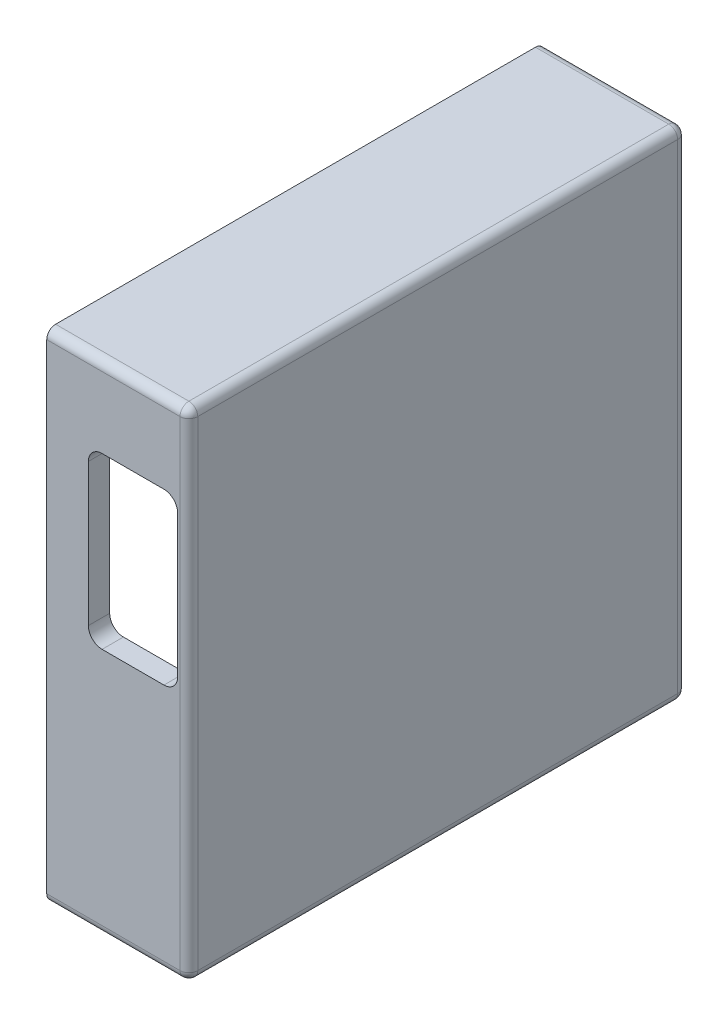
ISO-10303-21;
HEADER;
FILE_DESCRIPTION(('STEP AP214'),'2;1');
FILE_NAME('part.step','',(''),(''),'','','');
FILE_SCHEMA(('AUTOMOTIVE_DESIGN { 1 0 10303 214 1 1 1 1 }'));
ENDSEC;
DATA;
#1=APPLICATION_CONTEXT('core data for automotive mechanical design processes');
#2=APPLICATION_PROTOCOL_DEFINITION('international standard','automotive_design',2000,#1);
#3=PRODUCT_CONTEXT('',#1,'mechanical');
#4=PRODUCT('Part','Part','',(#3));
#5=PRODUCT_RELATED_PRODUCT_CATEGORY('part','',(#4));
#6=PRODUCT_DEFINITION_FORMATION('','',#4);
#7=PRODUCT_DEFINITION_CONTEXT('part definition',#1,'design');
#8=PRODUCT_DEFINITION('design','',#6,#7);
#9=PRODUCT_DEFINITION_SHAPE('','',#8);
#10=(LENGTH_UNIT() NAMED_UNIT(*) SI_UNIT(.MILLI.,.METRE.));
#11=(NAMED_UNIT(*) PLANE_ANGLE_UNIT() SI_UNIT($,.RADIAN.));
#12=(NAMED_UNIT(*) SI_UNIT($,.STERADIAN.) SOLID_ANGLE_UNIT());
#13=UNCERTAINTY_MEASURE_WITH_UNIT(LENGTH_MEASURE(1.E-05),#10,'distance_accuracy_value','');
#14=(GEOMETRIC_REPRESENTATION_CONTEXT(3) GLOBAL_UNCERTAINTY_ASSIGNED_CONTEXT((#13)) GLOBAL_UNIT_ASSIGNED_CONTEXT((#10,
#11,#12)) REPRESENTATION_CONTEXT('',''));
#15=CARTESIAN_POINT('',(0.,0.,0.));
#16=DIRECTION('',(0.,0.,1.));
#17=DIRECTION('',(1.,0.,0.));
#18=AXIS2_PLACEMENT_3D('',#15,#16,#17);
#19=CARTESIAN_POINT('',(25.4,0.,0.));
#20=DIRECTION('',(1.,0.,0.));
#21=DIRECTION('',(0.,0.,-1.));
#22=AXIS2_PLACEMENT_3D('',#19,#20,#21);
#23=PLANE('',#22);
#24=CARTESIAN_POINT('',(25.4,-85.725,85.725));
#25=DIRECTION('',(1.,0.,0.));
#26=DIRECTION('',(0.,0.,-1.));
#27=AXIS2_PLACEMENT_3D('',#24,#25,#26);
#28=CIRCLE('',#27,3.175);
#29=CARTESIAN_POINT('',(25.4,-88.9,85.725));
#30=VERTEX_POINT('',#29);
#31=CARTESIAN_POINT('',(25.4,-85.725,88.9));
#32=VERTEX_POINT('',#31);
#33=EDGE_CURVE('E420',#30,#32,#28,.F.);
#34=ORIENTED_EDGE('',*,*,#33,.T.);
#35=DIRECTION('',(0.,-1.,0.));
#36=VECTOR('',#35,1.);
#37=CARTESIAN_POINT('',(25.4,-88.9,88.9));
#38=LINE('',#37,#36);
#39=CARTESIAN_POINT('',(25.4,85.725,88.9));
#40=VERTEX_POINT('',#39);
#41=EDGE_CURVE('E412',#40,#32,#38,.T.);
#42=ORIENTED_EDGE('',*,*,#41,.F.);
#43=CARTESIAN_POINT('',(25.4,85.725,85.725));
#44=DIRECTION('',(1.,0.,0.));
#45=DIRECTION('',(0.,0.,-1.));
#46=AXIS2_PLACEMENT_3D('',#43,#44,#45);
#47=CIRCLE('',#46,3.175);
#48=CARTESIAN_POINT('',(25.4,88.9,85.725));
#49=VERTEX_POINT('',#48);
#50=EDGE_CURVE('E417',#40,#49,#47,.F.);
#51=ORIENTED_EDGE('',*,*,#50,.T.);
#52=DIRECTION('',(0.,0.,1.));
#53=VECTOR('',#52,1.);
#54=CARTESIAN_POINT('',(25.4,88.9,88.9));
#55=LINE('',#54,#53);
#56=CARTESIAN_POINT('',(25.4,88.9,-85.725));
#57=VERTEX_POINT('',#56);
#58=EDGE_CURVE('E410',#57,#49,#55,.T.);
#59=ORIENTED_EDGE('',*,*,#58,.F.);
#60=CARTESIAN_POINT('',(25.4,85.725,-85.725));
#61=DIRECTION('',(1.,0.,0.));
#62=DIRECTION('',(0.,0.,-1.));
#63=AXIS2_PLACEMENT_3D('',#60,#61,#62);
#64=CIRCLE('',#63,3.175);
#65=CARTESIAN_POINT('',(25.4,85.725,-88.9));
#66=VERTEX_POINT('',#65);
#67=EDGE_CURVE('E11',#57,#66,#64,.F.);
#68=ORIENTED_EDGE('',*,*,#67,.T.);
#69=DIRECTION('',(0.,1.,0.));
#70=VECTOR('',#69,1.);
#71=CARTESIAN_POINT('',(25.4,-88.9,-88.9));
#72=LINE('',#71,#70);
#73=CARTESIAN_POINT('',(25.4,-85.725,-88.9));
#74=VERTEX_POINT('',#73);
#75=EDGE_CURVE('E52',#74,#66,#72,.T.);
#76=ORIENTED_EDGE('',*,*,#75,.F.);
#77=CARTESIAN_POINT('',(25.4,-85.725,-85.725));
#78=DIRECTION('',(1.,0.,0.));
#79=DIRECTION('',(0.,0.,-1.));
#80=AXIS2_PLACEMENT_3D('',#77,#78,#79);
#81=CIRCLE('',#80,3.175);
#82=CARTESIAN_POINT('',(25.4,-88.9,-85.725));
#83=VERTEX_POINT('',#82);
#84=EDGE_CURVE('E44',#74,#83,#81,.F.);
#85=ORIENTED_EDGE('',*,*,#84,.T.);
#86=DIRECTION('',(0.,0.,-1.));
#87=VECTOR('',#86,1.);
#88=CARTESIAN_POINT('',(25.4,-88.9,88.9));
#89=LINE('',#88,#87);
#90=EDGE_CURVE('E376',#30,#83,#89,.T.);
#91=ORIENTED_EDGE('',*,*,#90,.F.);
#92=EDGE_LOOP('',(#34,#42,#51,#59,#68,#76,#85,#91));
#93=FACE_BOUND('',#92,.T.);
#94=DIRECTION('',(0.,0.,1.));
#95=VECTOR('',#94,1.);
#96=CARTESIAN_POINT('',(25.4,81.28,88.9));
#97=LINE('',#96,#95);
#98=CARTESIAN_POINT('',(25.4,81.28,-68.58));
#99=VERTEX_POINT('',#98);
#100=CARTESIAN_POINT('',(25.4,81.28,68.58));
#101=VERTEX_POINT('',#100);
#102=EDGE_CURVE('E431',#99,#101,#97,.T.);
#103=ORIENTED_EDGE('',*,*,#102,.T.);
#104=CARTESIAN_POINT('',(25.4,81.28,81.28));
#105=DIRECTION('',(1.,0.,0.));
#106=DIRECTION('',(0.,0.,-1.));
#107=AXIS2_PLACEMENT_3D('',#104,#105,#106);
#108=CIRCLE('',#107,12.7);
#109=CARTESIAN_POINT('',(25.4,68.58,81.28));
#110=VERTEX_POINT('',#109);
#111=EDGE_CURVE('E427',#110,#101,#108,.T.);
#112=ORIENTED_EDGE('',*,*,#111,.F.);
#113=DIRECTION('',(0.,-1.,0.));
#114=VECTOR('',#113,1.);
#115=CARTESIAN_POINT('',(25.4,-88.9,81.28));
#116=LINE('',#115,#114);
#117=CARTESIAN_POINT('',(25.4,-68.5799999999999,81.28));
#118=VERTEX_POINT('',#117);
#119=EDGE_CURVE('E432',#110,#118,#116,.T.);
#120=ORIENTED_EDGE('',*,*,#119,.T.);
#121=CARTESIAN_POINT('',(25.4,-81.2799999999999,81.28));
#122=DIRECTION('',(1.,0.,0.));
#123=DIRECTION('',(0.,0.,-1.));
#124=AXIS2_PLACEMENT_3D('',#121,#122,#123);
#125=CIRCLE('',#124,12.7);
#126=CARTESIAN_POINT('',(25.4,-81.2799999999999,68.58));
#127=VERTEX_POINT('',#126);
#128=EDGE_CURVE('E414',#127,#118,#125,.T.);
#129=ORIENTED_EDGE('',*,*,#128,.F.);
#130=DIRECTION('',(0.,0.,-1.));
#131=VECTOR('',#130,1.);
#132=CARTESIAN_POINT('',(25.4,-81.28,88.9));
#133=LINE('',#132,#131);
#134=CARTESIAN_POINT('',(25.4,-81.2799999999999,-68.58));
#135=VERTEX_POINT('',#134);
#136=EDGE_CURVE('E428',#127,#135,#133,.T.);
#137=ORIENTED_EDGE('',*,*,#136,.T.);
#138=CARTESIAN_POINT('',(25.4,-81.2799999999999,-81.28));
#139=DIRECTION('',(1.,0.,0.));
#140=DIRECTION('',(0.,0.,-1.));
#141=AXIS2_PLACEMENT_3D('',#138,#139,#140);
#142=CIRCLE('',#141,12.7);
#143=CARTESIAN_POINT('',(25.4,-68.5799999999999,-81.28));
#144=VERTEX_POINT('',#143);
#145=EDGE_CURVE('E436',#144,#135,#142,.T.);
#146=ORIENTED_EDGE('',*,*,#145,.F.);
#147=DIRECTION('',(0.,1.,0.));
#148=VECTOR('',#147,1.);
#149=CARTESIAN_POINT('',(25.4,-88.9,-81.28));
#150=LINE('',#149,#148);
#151=CARTESIAN_POINT('',(25.4,68.58,-81.28));
#152=VERTEX_POINT('',#151);
#153=EDGE_CURVE('E425',#144,#152,#150,.T.);
#154=ORIENTED_EDGE('',*,*,#153,.T.);
#155=CARTESIAN_POINT('',(25.4,81.28,-81.28));
#156=DIRECTION('',(1.,0.,0.));
#157=DIRECTION('',(0.,0.,-1.));
#158=AXIS2_PLACEMENT_3D('',#155,#156,#157);
#159=CIRCLE('',#158,12.7);
#160=EDGE_CURVE('E39',#99,#152,#159,.T.);
#161=ORIENTED_EDGE('',*,*,#160,.F.);
#162=EDGE_LOOP('',(#103,#112,#120,#129,#137,#146,#154,#161));
#163=FACE_BOUND('',#162,.T.);
#164=ADVANCED_FACE('F36',(#93,#163),#23,.F.);
#165=CARTESIAN_POINT('',(76.2,-88.9,81.28));
#166=DIRECTION('',(0.,0.,-1.));
#167=DIRECTION('',(-1.,0.,0.));
#168=AXIS2_PLACEMENT_3D('',#165,#166,#167);
#169=PLANE('',#168);
#170=DIRECTION('',(0.,-1.,0.));
#171=VECTOR('',#170,1.);
#172=CARTESIAN_POINT('',(68.58,0.,81.28));
#173=LINE('',#172,#171);
#174=CARTESIAN_POINT('',(68.58,60.1907070784368,81.28));
#175=VERTEX_POINT('',#174);
#176=CARTESIAN_POINT('',(68.58,-0.0545610052521571,81.28));
#177=VERTEX_POINT('',#176);
#178=EDGE_CURVE('E332',#175,#177,#173,.T.);
#179=ORIENTED_EDGE('',*,*,#178,.T.);
#180=CARTESIAN_POINT('',(67.2735821086599,4.66807303659209,81.28));
#181=DIRECTION('',(0.,0.,-1.));
#182=DIRECTION('',(-1.,0.,0.));
#183=AXIS2_PLACEMENT_3D('',#180,#181,#182);
#184=CIRCLE('',#183,4.89999999999996);
#185=CARTESIAN_POINT('',(72.1735821086599,4.66807303659221,81.28));
#186=VERTEX_POINT('',#185);
#187=EDGE_CURVE('E288',#177,#186,#184,.F.);
#188=ORIENTED_EDGE('',*,*,#187,.T.);
#189=DIRECTION('',(0.,1.,0.));
#190=VECTOR('',#189,1.);
#191=CARTESIAN_POINT('',(72.17358210866,4.66807303659221,81.28));
#192=LINE('',#191,#190);
#193=CARTESIAN_POINT('',(72.17358210866,55.468073036593,81.28));
#194=VERTEX_POINT('',#193);
#195=EDGE_CURVE('E280',#186,#194,#192,.T.);
#196=ORIENTED_EDGE('',*,*,#195,.T.);
#197=CARTESIAN_POINT('',(67.2735821086599,55.4680730365921,81.28));
#198=DIRECTION('',(0.,0.,-1.));
#199=DIRECTION('',(-1.,0.,0.));
#200=AXIS2_PLACEMENT_3D('',#197,#198,#199);
#201=CIRCLE('',#200,4.9000000000004);
#202=EDGE_CURVE('E276',#194,#175,#201,.F.);
#203=ORIENTED_EDGE('',*,*,#202,.T.);
#204=EDGE_LOOP('',(#179,#188,#196,#203));
#205=FACE_BOUND('',#204,.T.);
#206=ADVANCED_FACE('F491',(#205),#169,.F.);
#207=CARTESIAN_POINT('',(76.2,0.,0.));
#208=DIRECTION('',(-1.,0.,0.));
#209=DIRECTION('',(0.,0.,1.));
#210=AXIS2_PLACEMENT_3D('',#207,#208,#209);
#211=PLANE('',#210);
#212=DIRECTION('',(0.,1.,0.));
#213=VECTOR('',#212,1.);
#214=CARTESIAN_POINT('',(76.2,0.,-85.725));
#215=LINE('',#214,#213);
#216=CARTESIAN_POINT('',(76.2,-85.725,-85.725));
#217=VERTEX_POINT('',#216);
#218=CARTESIAN_POINT('',(76.2,85.725,-85.725));
#219=VERTEX_POINT('',#218);
#220=EDGE_CURVE('E357',#217,#219,#215,.T.);
#221=ORIENTED_EDGE('',*,*,#220,.T.);
#222=DIRECTION('',(0.,0.,1.));
#223=VECTOR('',#222,1.);
#224=CARTESIAN_POINT('',(76.2,85.725,0.));
#225=LINE('',#224,#223);
#226=CARTESIAN_POINT('',(76.2,85.725,85.725));
#227=VERTEX_POINT('',#226);
#228=EDGE_CURVE('E359',#219,#227,#225,.T.);
#229=ORIENTED_EDGE('',*,*,#228,.T.);
#230=DIRECTION('',(0.,-1.,0.));
#231=VECTOR('',#230,1.);
#232=CARTESIAN_POINT('',(76.2,0.,85.725));
#233=LINE('',#232,#231);
#234=CARTESIAN_POINT('',(76.2,-85.725,85.725));
#235=VERTEX_POINT('',#234);
#236=EDGE_CURVE('E353',#227,#235,#233,.T.);
#237=ORIENTED_EDGE('',*,*,#236,.T.);
#238=DIRECTION('',(0.,0.,-1.));
#239=VECTOR('',#238,1.);
#240=CARTESIAN_POINT('',(76.2,-85.725,0.));
#241=LINE('',#240,#239);
#242=EDGE_CURVE('E355',#235,#217,#241,.T.);
#243=ORIENTED_EDGE('',*,*,#242,.T.);
#244=EDGE_LOOP('',(#221,#229,#237,#243));
#245=FACE_BOUND('',#244,.T.);
#246=ADVANCED_FACE('F496',(#245),#211,.F.);
#247=CARTESIAN_POINT('',(73.025,0.,-85.725));
#248=DIRECTION('',(0.,1.,0.));
#249=DIRECTION('',(0.,0.,1.));
#250=AXIS2_PLACEMENT_3D('',#247,#248,#249);
#251=CYLINDRICAL_SURFACE('',#250,3.175);
#252=CARTESIAN_POINT('',(73.025,-85.725,-85.725));
#253=DIRECTION('',(0.,-1.,0.));
#254=DIRECTION('',(0.,0.,-1.));
#255=AXIS2_PLACEMENT_3D('',#252,#253,#254);
#256=CIRCLE('',#255,3.175);
#257=CARTESIAN_POINT('',(73.025,-85.725,-88.9));
#258=VERTEX_POINT('',#257);
#259=EDGE_CURVE('E387',#217,#258,#256,.F.);
#260=ORIENTED_EDGE('',*,*,#259,.T.);
#261=DIRECTION('',(0.,1.,0.));
#262=VECTOR('',#261,1.);
#263=CARTESIAN_POINT('',(73.025,-88.9,-88.9));
#264=LINE('',#263,#262);
#265=CARTESIAN_POINT('',(73.025,85.725,-88.9));
#266=VERTEX_POINT('',#265);
#267=EDGE_CURVE('E349',#266,#258,#264,.F.);
#268=ORIENTED_EDGE('',*,*,#267,.F.);
#269=CARTESIAN_POINT('',(73.025,85.725,-85.725));
#270=DIRECTION('',(0.,1.,0.));
#271=DIRECTION('',(0.,0.,1.));
#272=AXIS2_PLACEMENT_3D('',#269,#270,#271);
#273=CIRCLE('',#272,3.175);
#274=EDGE_CURVE('E382',#219,#266,#273,.T.);
#275=ORIENTED_EDGE('',*,*,#274,.F.);
#276=ORIENTED_EDGE('',*,*,#220,.F.);
#277=EDGE_LOOP('',(#260,#268,#275,#276));
#278=FACE_BOUND('',#277,.T.);
#279=ADVANCED_FACE('F543',(#278),#251,.T.);
#280=CARTESIAN_POINT('',(73.025,85.725,0.));
#281=DIRECTION('',(0.,0.,1.));
#282=DIRECTION('',(1.,0.,0.));
#283=AXIS2_PLACEMENT_3D('',#280,#281,#282);
#284=CYLINDRICAL_SURFACE('',#283,3.175);
#285=CARTESIAN_POINT('',(73.025,85.725,85.725));
#286=DIRECTION('',(0.,0.,1.));
#287=DIRECTION('',(1.,0.,0.));
#288=AXIS2_PLACEMENT_3D('',#285,#286,#287);
#289=CIRCLE('',#288,3.175);
#290=CARTESIAN_POINT('',(73.025,88.9,85.725));
#291=VERTEX_POINT('',#290);
#292=EDGE_CURVE('E385',#291,#227,#289,.F.);
#293=ORIENTED_EDGE('',*,*,#292,.T.);
#294=ORIENTED_EDGE('',*,*,#228,.F.);
#295=CARTESIAN_POINT('',(73.025,85.725,-85.725));
#296=DIRECTION('',(0.,0.,-1.));
#297=DIRECTION('',(-1.,0.,0.));
#298=AXIS2_PLACEMENT_3D('',#295,#296,#297);
#299=CIRCLE('',#298,3.175);
#300=CARTESIAN_POINT('',(73.025,88.9,-85.725));
#301=VERTEX_POINT('',#300);
#302=EDGE_CURVE('E379',#301,#219,#299,.T.);
#303=ORIENTED_EDGE('',*,*,#302,.F.);
#304=DIRECTION('',(0.,0.,1.));
#305=VECTOR('',#304,1.);
#306=CARTESIAN_POINT('',(73.025,88.9,88.9));
#307=LINE('',#306,#305);
#308=EDGE_CURVE('E342',#291,#301,#307,.F.);
#309=ORIENTED_EDGE('',*,*,#308,.F.);
#310=EDGE_LOOP('',(#293,#294,#303,#309));
#311=FACE_BOUND('',#310,.T.);
#312=ADVANCED_FACE('F524',(#311),#284,.T.);
#313=CARTESIAN_POINT('',(73.025,0.,85.725));
#314=DIRECTION('',(0.,-1.,0.));
#315=DIRECTION('',(0.,0.,-1.));
#316=AXIS2_PLACEMENT_3D('',#313,#314,#315);
#317=CYLINDRICAL_SURFACE('',#316,3.175);
#318=CARTESIAN_POINT('',(73.025,-85.725,85.725));
#319=DIRECTION('',(0.,-1.,0.));
#320=DIRECTION('',(0.,0.,-1.));
#321=AXIS2_PLACEMENT_3D('',#318,#319,#320);
#322=CIRCLE('',#321,3.175);
#323=CARTESIAN_POINT('',(73.025,-85.725,88.9));
#324=VERTEX_POINT('',#323);
#325=EDGE_CURVE('E402',#324,#235,#322,.F.);
#326=ORIENTED_EDGE('',*,*,#325,.T.);
#327=ORIENTED_EDGE('',*,*,#236,.F.);
#328=CARTESIAN_POINT('',(73.025,85.725,85.725));
#329=DIRECTION('',(0.,1.,0.));
#330=DIRECTION('',(-1.,0.,0.));
#331=AXIS2_PLACEMENT_3D('',#328,#329,#330);
#332=CIRCLE('',#331,3.175);
#333=CARTESIAN_POINT('',(73.025,85.725,88.9));
#334=VERTEX_POINT('',#333);
#335=EDGE_CURVE('E393',#334,#227,#332,.T.);
#336=ORIENTED_EDGE('',*,*,#335,.F.);
#337=DIRECTION('',(0.,-1.,0.));
#338=VECTOR('',#337,1.);
#339=CARTESIAN_POINT('',(73.025,-88.9,88.9));
#340=LINE('',#339,#338);
#341=EDGE_CURVE('E364',#324,#334,#340,.F.);
#342=ORIENTED_EDGE('',*,*,#341,.F.);
#343=EDGE_LOOP('',(#326,#327,#336,#342));
#344=FACE_BOUND('',#343,.T.);
#345=ADVANCED_FACE('F517',(#344),#317,.T.);
#346=CARTESIAN_POINT('',(72.17358210866,4.66807303659221,12.7966443579163));
#347=DIRECTION('',(1.,0.,0.));
#348=DIRECTION('',(0.,0.,-1.));
#349=AXIS2_PLACEMENT_3D('',#346,#347,#348);
#350=PLANE('',#349);
#351=DIRECTION('',(0.,0.,1.));
#352=VECTOR('',#351,1.);
#353=CARTESIAN_POINT('',(72.17358210866,4.66807303659221,12.7966443579163));
#354=LINE('',#353,#352);
#355=CARTESIAN_POINT('',(72.17358210866,4.66807303659221,88.9));
#356=VERTEX_POINT('',#355);
#357=EDGE_CURVE('E284',#186,#356,#354,.T.);
#358=ORIENTED_EDGE('',*,*,#357,.T.);
#359=DIRECTION('',(0.,1.,0.));
#360=VECTOR('',#359,1.);
#361=CARTESIAN_POINT('',(72.17358210866,4.66807303659221,88.9));
#362=LINE('',#361,#360);
#363=CARTESIAN_POINT('',(72.1735821086603,55.468073036593,88.9));
#364=VERTEX_POINT('',#363);
#365=EDGE_CURVE('E255',#356,#364,#362,.T.);
#366=ORIENTED_EDGE('',*,*,#365,.T.);
#367=DIRECTION('',(0.,0.,1.));
#368=VECTOR('',#367,1.);
#369=CARTESIAN_POINT('',(72.1735821086603,55.468073036593,12.7966443579163));
#370=LINE('',#369,#368);
#371=EDGE_CURVE('E283',#194,#364,#370,.T.);
#372=ORIENTED_EDGE('',*,*,#371,.F.);
#373=ORIENTED_EDGE('',*,*,#195,.F.);
#374=EDGE_LOOP('',(#358,#366,#372,#373));
#375=FACE_BOUND('',#374,.T.);
#376=ADVANCED_FACE('F578',(#375),#350,.F.);
#377=CARTESIAN_POINT('',(67.2735821086599,55.4680730365921,12.7966443579163));
#378=DIRECTION('',(0.,0.,1.));
#379=DIRECTION('',(1.,0.,0.));
#380=AXIS2_PLACEMENT_3D('',#377,#378,#379);
#381=CYLINDRICAL_SURFACE('',#380,4.9000000000004);
#382=ORIENTED_EDGE('',*,*,#371,.T.);
#383=CARTESIAN_POINT('',(67.2735821086599,55.4680730365921,88.9));
#384=DIRECTION('',(0.,0.,1.));
#385=DIRECTION('',(1.,0.,0.));
#386=AXIS2_PLACEMENT_3D('',#383,#384,#385);
#387=CIRCLE('',#386,4.9000000000004);
#388=CARTESIAN_POINT('',(67.2735821086601,60.3680730365927,88.9));
#389=VERTEX_POINT('',#388);
#390=EDGE_CURVE('E252',#364,#389,#387,.T.);
#391=ORIENTED_EDGE('',*,*,#390,.T.);
#392=DIRECTION('',(0.,0.,1.));
#393=VECTOR('',#392,1.);
#394=CARTESIAN_POINT('',(67.2735821086601,60.3680730365927,12.7966443579163));
#395=LINE('',#394,#393);
#396=CARTESIAN_POINT('',(67.2735821086601,60.3680730365925,81.28));
#397=VERTEX_POINT('',#396);
#398=EDGE_CURVE('E275',#397,#389,#395,.T.);
#399=ORIENTED_EDGE('',*,*,#398,.F.);
#400=EDGE_CURVE('E279',#175,#397,#201,.F.);
#401=ORIENTED_EDGE('',*,*,#400,.F.);
#402=ORIENTED_EDGE('',*,*,#202,.F.);
#403=EDGE_LOOP('',(#382,#391,#399,#401,#402));
#404=FACE_BOUND('',#403,.T.);
#405=ADVANCED_FACE('F583',(#404),#381,.F.);
#406=CARTESIAN_POINT('',(67.2735821086601,60.3680730365927,12.7966443579163));
#407=DIRECTION('',(0.,1.,0.));
#408=DIRECTION('',(0.,0.,1.));
#409=AXIS2_PLACEMENT_3D('',#406,#407,#408);
#410=PLANE('',#409);
#411=ORIENTED_EDGE('',*,*,#398,.T.);
#412=DIRECTION('',(-1.,0.,0.));
#413=VECTOR('',#412,1.);
#414=CARTESIAN_POINT('',(67.2735821086601,60.3680730365927,88.9));
#415=LINE('',#414,#413);
#416=CARTESIAN_POINT('',(45.1735821086601,60.3680730365923,88.9));
#417=VERTEX_POINT('',#416);
#418=EDGE_CURVE('E236',#389,#417,#415,.T.);
#419=ORIENTED_EDGE('',*,*,#418,.T.);
#420=DIRECTION('',(0.,0.,1.));
#421=VECTOR('',#420,1.);
#422=CARTESIAN_POINT('',(45.1735821086601,60.3680730365923,12.7966443579163));
#423=LINE('',#422,#421);
#424=CARTESIAN_POINT('',(45.1735821086601,60.3680730365927,81.28));
#425=VERTEX_POINT('',#424);
#426=EDGE_CURVE('E232',#425,#417,#423,.T.);
#427=ORIENTED_EDGE('',*,*,#426,.F.);
#428=DIRECTION('',(-1.,0.,0.));
#429=VECTOR('',#428,1.);
#430=CARTESIAN_POINT('',(67.2735821086601,60.3680730365927,81.28));
#431=LINE('',#430,#429);
#432=EDGE_CURVE('E272',#397,#425,#431,.T.);
#433=ORIENTED_EDGE('',*,*,#432,.F.);
#434=EDGE_LOOP('',(#411,#419,#427,#433));
#435=FACE_BOUND('',#434,.T.);
#436=ADVANCED_FACE('F704',(#435),#410,.F.);
#437=CARTESIAN_POINT('',(45.1735821086599,55.4680730365921,12.7966443579163));
#438=DIRECTION('',(0.,0.,1.));
#439=DIRECTION('',(1.,0.,0.));
#440=AXIS2_PLACEMENT_3D('',#437,#438,#439);
#441=CYLINDRICAL_SURFACE('',#440,4.90000000000021);
#442=ORIENTED_EDGE('',*,*,#426,.T.);
#443=CARTESIAN_POINT('',(45.1735821086599,55.4680730365921,88.9));
#444=DIRECTION('',(0.,0.,1.));
#445=DIRECTION('',(1.,0.,0.));
#446=AXIS2_PLACEMENT_3D('',#443,#444,#445);
#447=CIRCLE('',#446,4.90000000000021);
#448=CARTESIAN_POINT('',(40.2735821086601,55.468073036593,88.9));
#449=VERTEX_POINT('',#448);
#450=EDGE_CURVE('E229',#417,#449,#447,.T.);
#451=ORIENTED_EDGE('',*,*,#450,.T.);
#452=DIRECTION('',(0.,0.,1.));
#453=VECTOR('',#452,1.);
#454=CARTESIAN_POINT('',(40.2735821086601,55.468073036593,12.7966443579163));
#455=LINE('',#454,#453);
#456=CARTESIAN_POINT('',(40.2735821086597,55.4680730365921,81.28));
#457=VERTEX_POINT('',#456);
#458=EDGE_CURVE('E215',#457,#449,#455,.T.);
#459=ORIENTED_EDGE('',*,*,#458,.F.);
#460=CARTESIAN_POINT('',(45.1735821086599,55.4680730365921,81.28));
#461=DIRECTION('',(0.,0.,-1.));
#462=DIRECTION('',(-1.,0.,0.));
#463=AXIS2_PLACEMENT_3D('',#460,#461,#462);
#464=CIRCLE('',#463,4.90000000000021);
#465=EDGE_CURVE('E226',#425,#457,#464,.F.);
#466=ORIENTED_EDGE('',*,*,#465,.F.);
#467=EDGE_LOOP('',(#442,#451,#459,#466));
#468=FACE_BOUND('',#467,.T.);
#469=ADVANCED_FACE('F230',(#468),#441,.F.);
#470=CARTESIAN_POINT('',(40.2735821086601,55.468073036593,12.7966443579163));
#471=DIRECTION('',(-1.,0.,0.));
#472=DIRECTION('',(0.,0.,1.));
#473=AXIS2_PLACEMENT_3D('',#470,#471,#472);
#474=PLANE('',#473);
#475=ORIENTED_EDGE('',*,*,#458,.T.);
#476=DIRECTION('',(0.,-1.,0.));
#477=VECTOR('',#476,1.);
#478=CARTESIAN_POINT('',(40.2735821086601,55.468073036593,88.9));
#479=LINE('',#478,#477);
#480=CARTESIAN_POINT('',(40.2735821086602,4.66807303659206,88.9));
#481=VERTEX_POINT('',#480);
#482=EDGE_CURVE('E220',#449,#481,#479,.T.);
#483=ORIENTED_EDGE('',*,*,#482,.T.);
#484=DIRECTION('',(0.,0.,1.));
#485=VECTOR('',#484,1.);
#486=CARTESIAN_POINT('',(40.2735821086601,4.668073036593,12.7966443579163));
#487=LINE('',#486,#485);
#488=CARTESIAN_POINT('',(40.2735821086601,4.668073036593,81.28));
#489=VERTEX_POINT('',#488);
#490=EDGE_CURVE('E269',#489,#481,#487,.T.);
#491=ORIENTED_EDGE('',*,*,#490,.F.);
#492=DIRECTION('',(0.,-1.,0.));
#493=VECTOR('',#492,1.);
#494=CARTESIAN_POINT('',(40.2735821086601,55.468073036593,81.28));
#495=LINE('',#494,#493);
#496=EDGE_CURVE('E223',#457,#489,#495,.T.);
#497=ORIENTED_EDGE('',*,*,#496,.F.);
#498=EDGE_LOOP('',(#475,#483,#491,#497));
#499=FACE_BOUND('',#498,.T.);
#500=ADVANCED_FACE('F217',(#499),#474,.F.);
#501=CARTESIAN_POINT('',(45.1735821086599,4.66807303659206,12.7966443579163));
#502=DIRECTION('',(0.,0.,1.));
#503=DIRECTION('',(1.,0.,0.));
#504=AXIS2_PLACEMENT_3D('',#501,#502,#503);
#505=CYLINDRICAL_SURFACE('',#504,4.89999999999969);
#506=ORIENTED_EDGE('',*,*,#490,.T.);
#507=CARTESIAN_POINT('',(45.1735821086599,4.66807303659206,88.9));
#508=DIRECTION('',(0.,0.,1.));
#509=DIRECTION('',(1.,0.,0.));
#510=AXIS2_PLACEMENT_3D('',#507,#508,#509);
#511=CIRCLE('',#510,4.89999999999969);
#512=CARTESIAN_POINT('',(45.1735821086601,-0.2319269634075,88.9));
#513=VERTEX_POINT('',#512);
#514=EDGE_CURVE('E244',#481,#513,#511,.T.);
#515=ORIENTED_EDGE('',*,*,#514,.T.);
#516=DIRECTION('',(0.,0.,1.));
#517=VECTOR('',#516,1.);
#518=CARTESIAN_POINT('',(45.1735821086601,-0.2319269634075,12.7966443579163));
#519=LINE('',#518,#517);
#520=CARTESIAN_POINT('',(45.1735821086601,-0.2319269634075,81.28));
#521=VERTEX_POINT('',#520);
#522=EDGE_CURVE('E268',#521,#513,#519,.T.);
#523=ORIENTED_EDGE('',*,*,#522,.F.);
#524=CARTESIAN_POINT('',(45.1735821086599,4.66807303659206,81.28));
#525=DIRECTION('',(0.,0.,-1.));
#526=DIRECTION('',(-1.,0.,0.));
#527=AXIS2_PLACEMENT_3D('',#524,#525,#526);
#528=CIRCLE('',#527,4.89999999999969);
#529=EDGE_CURVE('E265',#489,#521,#528,.F.);
#530=ORIENTED_EDGE('',*,*,#529,.F.);
#531=EDGE_LOOP('',(#506,#515,#523,#530));
#532=FACE_BOUND('',#531,.T.);
#533=ADVANCED_FACE('F675',(#532),#505,.F.);
#534=CARTESIAN_POINT('',(45.1735821086601,-0.2319269634075,12.7966443579163));
#535=DIRECTION('',(0.,-1.,0.));
#536=DIRECTION('',(1.,0.,0.));
#537=AXIS2_PLACEMENT_3D('',#534,#535,#536);
#538=PLANE('',#537);
#539=ORIENTED_EDGE('',*,*,#522,.T.);
#540=DIRECTION('',(1.,0.,0.));
#541=VECTOR('',#540,1.);
#542=CARTESIAN_POINT('',(45.1735821086601,-0.2319269634075,88.9));
#543=LINE('',#542,#541);
#544=CARTESIAN_POINT('',(67.2735821086601,-0.231926963407875,88.9));
#545=VERTEX_POINT('',#544);
#546=EDGE_CURVE('E261',#513,#545,#543,.T.);
#547=ORIENTED_EDGE('',*,*,#546,.T.);
#548=DIRECTION('',(0.,0.,1.));
#549=VECTOR('',#548,1.);
#550=CARTESIAN_POINT('',(67.2735821086601,-0.231926963407875,12.7966443579163));
#551=LINE('',#550,#549);
#552=CARTESIAN_POINT('',(67.2735821086601,-0.231926963407875,81.28));
#553=VERTEX_POINT('',#552);
#554=EDGE_CURVE('E248',#553,#545,#551,.T.);
#555=ORIENTED_EDGE('',*,*,#554,.F.);
#556=DIRECTION('',(1.,0.,0.));
#557=VECTOR('',#556,1.);
#558=CARTESIAN_POINT('',(45.1735821086601,-0.2319269634075,81.28));
#559=LINE('',#558,#557);
#560=EDGE_CURVE('E245',#521,#553,#559,.T.);
#561=ORIENTED_EDGE('',*,*,#560,.F.);
#562=EDGE_LOOP('',(#539,#547,#555,#561));
#563=FACE_BOUND('',#562,.T.);
#564=ADVANCED_FACE('F664',(#563),#538,.F.);
#565=CARTESIAN_POINT('',(67.2735821086599,4.66807303659209,12.7966443579163));
#566=DIRECTION('',(0.,0.,1.));
#567=DIRECTION('',(1.,0.,0.));
#568=AXIS2_PLACEMENT_3D('',#565,#566,#567);
#569=CYLINDRICAL_SURFACE('',#568,4.89999999999996);
#570=ORIENTED_EDGE('',*,*,#554,.T.);
#571=CARTESIAN_POINT('',(67.2735821086599,4.66807303659209,88.9));
#572=DIRECTION('',(0.,0.,1.));
#573=DIRECTION('',(1.,0.,0.));
#574=AXIS2_PLACEMENT_3D('',#571,#572,#573);
#575=CIRCLE('',#574,4.89999999999996);
#576=EDGE_CURVE('E258',#545,#356,#575,.T.);
#577=ORIENTED_EDGE('',*,*,#576,.T.);
#578=ORIENTED_EDGE('',*,*,#357,.F.);
#579=ORIENTED_EDGE('',*,*,#187,.F.);
#580=EDGE_CURVE('E285',#553,#177,#184,.F.);
#581=ORIENTED_EDGE('',*,*,#580,.F.);
#582=EDGE_LOOP('',(#570,#577,#578,#579,#581));
#583=FACE_BOUND('',#582,.T.);
#584=ADVANCED_FACE('F561',(#583),#569,.F.);
#585=CARTESIAN_POINT('',(73.025,-85.725,0.));
#586=DIRECTION('',(0.,0.,-1.));
#587=DIRECTION('',(-1.,0.,0.));
#588=AXIS2_PLACEMENT_3D('',#585,#586,#587);
#589=CYLINDRICAL_SURFACE('',#588,3.175);
#590=CARTESIAN_POINT('',(73.025,-85.725,85.725));
#591=DIRECTION('',(0.,0.,1.));
#592=DIRECTION('',(1.,0.,0.));
#593=AXIS2_PLACEMENT_3D('',#590,#591,#592);
#594=CIRCLE('',#593,3.175);
#595=CARTESIAN_POINT('',(73.025,-88.9,85.725));
#596=VERTEX_POINT('',#595);
#597=EDGE_CURVE('E405',#235,#596,#594,.F.);
#598=ORIENTED_EDGE('',*,*,#597,.T.);
#599=DIRECTION('',(0.,0.,-1.));
#600=VECTOR('',#599,1.);
#601=CARTESIAN_POINT('',(73.025,-88.9,88.9));
#602=LINE('',#601,#600);
#603=CARTESIAN_POINT('',(73.025,-88.9,-85.725));
#604=VERTEX_POINT('',#603);
#605=EDGE_CURVE('E372',#604,#596,#602,.F.);
#606=ORIENTED_EDGE('',*,*,#605,.F.);
#607=CARTESIAN_POINT('',(73.025,-85.725,-85.725));
#608=DIRECTION('',(0.,0.,-1.));
#609=DIRECTION('',(-1.,0.,0.));
#610=AXIS2_PLACEMENT_3D('',#607,#608,#609);
#611=CIRCLE('',#610,3.175);
#612=EDGE_CURVE('E396',#217,#604,#611,.T.);
#613=ORIENTED_EDGE('',*,*,#612,.F.);
#614=ORIENTED_EDGE('',*,*,#242,.F.);
#615=EDGE_LOOP('',(#598,#606,#613,#614));
#616=FACE_BOUND('',#615,.T.);
#617=ADVANCED_FACE('F548',(#616),#589,.T.);
#618=CARTESIAN_POINT('',(73.025,-85.725,85.725));
#619=DIRECTION('',(0.,-1.,0.));
#620=DIRECTION('',(0.,0.,-1.));
#621=AXIS2_PLACEMENT_3D('',#618,#619,#620);
#622=SPHERICAL_SURFACE('',#621,3.175);
#623=ORIENTED_EDGE('',*,*,#325,.F.);
#624=CARTESIAN_POINT('',(73.025,-85.725,85.725));
#625=DIRECTION('',(1.,0.,0.));
#626=DIRECTION('',(0.,0.,-1.));
#627=AXIS2_PLACEMENT_3D('',#624,#625,#626);
#628=CIRCLE('',#627,3.175);
#629=EDGE_CURVE('E340',#324,#596,#628,.T.);
#630=ORIENTED_EDGE('',*,*,#629,.T.);
#631=ORIENTED_EDGE('',*,*,#597,.F.);
#632=EDGE_LOOP('',(#623,#630,#631));
#633=FACE_BOUND('',#632,.T.);
#634=ADVANCED_FACE('F553',(#633),#622,.T.);
#635=CARTESIAN_POINT('',(76.2,-88.9,88.9));
#636=DIRECTION('',(0.,1.,0.));
#637=DIRECTION('',(0.,0.,1.));
#638=AXIS2_PLACEMENT_3D('',#635,#636,#637);
#639=PLANE('',#638);
#640=DIRECTION('',(-1.,0.,0.));
#641=VECTOR('',#640,1.);
#642=CARTESIAN_POINT('',(76.2,-88.9,85.725));
#643=LINE('',#642,#641);
#644=EDGE_CURVE('E369',#596,#30,#643,.T.);
#645=ORIENTED_EDGE('',*,*,#644,.T.);
#646=ORIENTED_EDGE('',*,*,#90,.T.);
#647=DIRECTION('',(-1.,0.,0.));
#648=VECTOR('',#647,1.);
#649=CARTESIAN_POINT('',(76.2,-88.9,-85.725));
#650=LINE('',#649,#648);
#651=EDGE_CURVE('E374',#83,#604,#650,.F.);
#652=ORIENTED_EDGE('',*,*,#651,.T.);
#653=ORIENTED_EDGE('',*,*,#605,.T.);
#654=EDGE_LOOP('',(#645,#646,#652,#653));
#655=FACE_BOUND('',#654,.T.);
#656=ADVANCED_FACE('F551',(#655),#639,.F.);
#657=CARTESIAN_POINT('',(73.025,-85.725,-85.725));
#658=DIRECTION('',(0.,-1.,0.));
#659=DIRECTION('',(0.,0.,-1.));
#660=AXIS2_PLACEMENT_3D('',#657,#658,#659);
#661=SPHERICAL_SURFACE('',#660,3.175);
#662=ORIENTED_EDGE('',*,*,#612,.T.);
#663=CARTESIAN_POINT('',(73.025,-85.725,-85.725));
#664=DIRECTION('',(1.,0.,0.));
#665=DIRECTION('',(0.,0.,-1.));
#666=AXIS2_PLACEMENT_3D('',#663,#664,#665);
#667=CIRCLE('',#666,3.175);
#668=EDGE_CURVE('E399',#604,#258,#667,.T.);
#669=ORIENTED_EDGE('',*,*,#668,.T.);
#670=ORIENTED_EDGE('',*,*,#259,.F.);
#671=EDGE_LOOP('',(#662,#669,#670));
#672=FACE_BOUND('',#671,.T.);
#673=ADVANCED_FACE('F540',(#672),#661,.T.);
#674=CARTESIAN_POINT('',(76.2,-88.9,-88.9));
#675=DIRECTION('',(0.,0.,1.));
#676=DIRECTION('',(1.,0.,0.));
#677=AXIS2_PLACEMENT_3D('',#674,#675,#676);
#678=PLANE('',#677);
#679=DIRECTION('',(-1.,0.,0.));
#680=VECTOR('',#679,1.);
#681=CARTESIAN_POINT('',(76.2,-85.725,-88.9));
#682=LINE('',#681,#680);
#683=EDGE_CURVE('E347',#258,#74,#682,.T.);
#684=ORIENTED_EDGE('',*,*,#683,.T.);
#685=ORIENTED_EDGE('',*,*,#75,.T.);
#686=DIRECTION('',(-1.,0.,0.));
#687=VECTOR('',#686,1.);
#688=CARTESIAN_POINT('',(76.2,85.725,-88.9));
#689=LINE('',#688,#687);
#690=EDGE_CURVE('E351',#66,#266,#689,.F.);
#691=ORIENTED_EDGE('',*,*,#690,.T.);
#692=ORIENTED_EDGE('',*,*,#267,.T.);
#693=EDGE_LOOP('',(#684,#685,#691,#692));
#694=FACE_BOUND('',#693,.T.);
#695=ADVANCED_FACE('F529',(#694),#678,.F.);
#696=CARTESIAN_POINT('',(73.025,85.725,-85.725));
#697=DIRECTION('',(1.,0.,0.));
#698=DIRECTION('',(0.,0.,-1.));
#699=AXIS2_PLACEMENT_3D('',#696,#697,#698);
#700=SPHERICAL_SURFACE('',#699,3.175);
#701=ORIENTED_EDGE('',*,*,#302,.T.);
#702=ORIENTED_EDGE('',*,*,#274,.T.);
#703=CARTESIAN_POINT('',(73.025,85.725,-85.725));
#704=DIRECTION('',(1.,0.,0.));
#705=DIRECTION('',(0.,0.,-1.));
#706=AXIS2_PLACEMENT_3D('',#703,#704,#705);
#707=CIRCLE('',#706,3.175);
#708=EDGE_CURVE('E324',#301,#266,#707,.F.);
#709=ORIENTED_EDGE('',*,*,#708,.F.);
#710=EDGE_LOOP('',(#701,#702,#709));
#711=FACE_BOUND('',#710,.T.);
#712=ADVANCED_FACE('F592',(#711),#700,.T.);
#713=CARTESIAN_POINT('',(76.2,88.9,88.9));
#714=DIRECTION('',(0.,-1.,0.));
#715=DIRECTION('',(0.,0.,-1.));
#716=AXIS2_PLACEMENT_3D('',#713,#714,#715);
#717=PLANE('',#716);
#718=DIRECTION('',(-1.,0.,0.));
#719=VECTOR('',#718,1.);
#720=CARTESIAN_POINT('',(76.2,88.9,-85.725));
#721=LINE('',#720,#719);
#722=EDGE_CURVE('E344',#301,#57,#721,.T.);
#723=ORIENTED_EDGE('',*,*,#722,.T.);
#724=ORIENTED_EDGE('',*,*,#58,.T.);
#725=DIRECTION('',(-1.,0.,0.));
#726=VECTOR('',#725,1.);
#727=CARTESIAN_POINT('',(76.2,88.9,85.725));
#728=LINE('',#727,#726);
#729=EDGE_CURVE('E328',#49,#291,#728,.F.);
#730=ORIENTED_EDGE('',*,*,#729,.T.);
#731=ORIENTED_EDGE('',*,*,#308,.T.);
#732=EDGE_LOOP('',(#723,#724,#730,#731));
#733=FACE_BOUND('',#732,.T.);
#734=ADVANCED_FACE('F527',(#733),#717,.F.);
#735=CARTESIAN_POINT('',(76.2,85.725,-85.725));
#736=DIRECTION('',(-1.,0.,0.));
#737=DIRECTION('',(0.,0.,1.));
#738=AXIS2_PLACEMENT_3D('',#735,#736,#737);
#739=CYLINDRICAL_SURFACE('',#738,3.175);
#740=ORIENTED_EDGE('',*,*,#67,.F.);
#741=ORIENTED_EDGE('',*,*,#722,.F.);
#742=ORIENTED_EDGE('',*,*,#708,.T.);
#743=ORIENTED_EDGE('',*,*,#690,.F.);
#744=EDGE_LOOP('',(#740,#741,#742,#743));
#745=FACE_BOUND('',#744,.T.);
#746=ADVANCED_FACE('F528',(#745),#739,.T.);
#747=CARTESIAN_POINT('',(76.2,-85.725,-85.725));
#748=DIRECTION('',(-1.,0.,0.));
#749=DIRECTION('',(0.,0.,1.));
#750=AXIS2_PLACEMENT_3D('',#747,#748,#749);
#751=CYLINDRICAL_SURFACE('',#750,3.175);
#752=ORIENTED_EDGE('',*,*,#84,.F.);
#753=ORIENTED_EDGE('',*,*,#683,.F.);
#754=ORIENTED_EDGE('',*,*,#668,.F.);
#755=ORIENTED_EDGE('',*,*,#651,.F.);
#756=EDGE_LOOP('',(#752,#753,#754,#755));
#757=FACE_BOUND('',#756,.T.);
#758=ADVANCED_FACE('F536',(#757),#751,.T.);
#759=CARTESIAN_POINT('',(73.025,85.725,85.725));
#760=DIRECTION('',(0.,0.,1.));
#761=DIRECTION('',(0.,-1.,0.));
#762=AXIS2_PLACEMENT_3D('',#759,#760,#761);
#763=SPHERICAL_SURFACE('',#762,3.175);
#764=CARTESIAN_POINT('',(73.025,85.725,85.725));
#765=DIRECTION('',(1.,0.,0.));
#766=DIRECTION('',(0.,0.,-1.));
#767=AXIS2_PLACEMENT_3D('',#764,#765,#766);
#768=CIRCLE('',#767,3.175);
#769=EDGE_CURVE('E390',#291,#334,#768,.T.);
#770=ORIENTED_EDGE('',*,*,#769,.T.);
#771=ORIENTED_EDGE('',*,*,#335,.T.);
#772=ORIENTED_EDGE('',*,*,#292,.F.);
#773=EDGE_LOOP('',(#770,#771,#772));
#774=FACE_BOUND('',#773,.T.);
#775=ADVANCED_FACE('F519',(#774),#763,.T.);
#776=CARTESIAN_POINT('',(76.2,-88.9,88.9));
#777=DIRECTION('',(0.,0.,-1.));
#778=DIRECTION('',(-1.,0.,0.));
#779=AXIS2_PLACEMENT_3D('',#776,#777,#778);
#780=PLANE('',#779);
#781=ORIENTED_EDGE('',*,*,#576,.F.);
#782=ORIENTED_EDGE('',*,*,#546,.F.);
#783=ORIENTED_EDGE('',*,*,#514,.F.);
#784=ORIENTED_EDGE('',*,*,#482,.F.);
#785=ORIENTED_EDGE('',*,*,#450,.F.);
#786=ORIENTED_EDGE('',*,*,#418,.F.);
#787=ORIENTED_EDGE('',*,*,#390,.F.);
#788=ORIENTED_EDGE('',*,*,#365,.F.);
#789=EDGE_LOOP('',(#781,#782,#783,#784,#785,#786,#787,#788));
#790=FACE_BOUND('',#789,.T.);
#791=DIRECTION('',(-1.,0.,0.));
#792=VECTOR('',#791,1.);
#793=CARTESIAN_POINT('',(76.2,85.725,88.9));
#794=LINE('',#793,#792);
#795=EDGE_CURVE('E366',#334,#40,#794,.T.);
#796=ORIENTED_EDGE('',*,*,#795,.T.);
#797=ORIENTED_EDGE('',*,*,#41,.T.);
#798=DIRECTION('',(-1.,0.,0.));
#799=VECTOR('',#798,1.);
#800=CARTESIAN_POINT('',(76.2,-85.725,88.9));
#801=LINE('',#800,#799);
#802=EDGE_CURVE('E362',#32,#324,#801,.F.);
#803=ORIENTED_EDGE('',*,*,#802,.T.);
#804=ORIENTED_EDGE('',*,*,#341,.T.);
#805=EDGE_LOOP('',(#796,#797,#803,#804));
#806=FACE_BOUND('',#805,.T.);
#807=ADVANCED_FACE('F240',(#790,#806),#780,.F.);
#808=CARTESIAN_POINT('',(76.2,85.725,85.725));
#809=DIRECTION('',(-1.,0.,0.));
#810=DIRECTION('',(0.,0.,1.));
#811=AXIS2_PLACEMENT_3D('',#808,#809,#810);
#812=CYLINDRICAL_SURFACE('',#811,3.175);
#813=ORIENTED_EDGE('',*,*,#50,.F.);
#814=ORIENTED_EDGE('',*,*,#795,.F.);
#815=ORIENTED_EDGE('',*,*,#769,.F.);
#816=ORIENTED_EDGE('',*,*,#729,.F.);
#817=EDGE_LOOP('',(#813,#814,#815,#816));
#818=FACE_BOUND('',#817,.T.);
#819=ADVANCED_FACE('F512',(#818),#812,.T.);
#820=CARTESIAN_POINT('',(76.2,-85.725,85.725));
#821=DIRECTION('',(-1.,0.,0.));
#822=DIRECTION('',(0.,0.,1.));
#823=AXIS2_PLACEMENT_3D('',#820,#821,#822);
#824=CYLINDRICAL_SURFACE('',#823,3.175);
#825=ORIENTED_EDGE('',*,*,#33,.F.);
#826=ORIENTED_EDGE('',*,*,#644,.F.);
#827=ORIENTED_EDGE('',*,*,#629,.F.);
#828=ORIENTED_EDGE('',*,*,#802,.F.);
#829=EDGE_LOOP('',(#825,#826,#827,#828));
#830=FACE_BOUND('',#829,.T.);
#831=ADVANCED_FACE('F505',(#830),#824,.T.);
#832=CARTESIAN_POINT('',(76.2,81.28,88.9));
#833=DIRECTION('',(0.,-1.,0.));
#834=DIRECTION('',(0.,0.,-1.));
#835=AXIS2_PLACEMENT_3D('',#832,#833,#834);
#836=PLANE('',#835);
#837=ORIENTED_EDGE('',*,*,#102,.F.);
#838=DIRECTION('',(1.,0.,0.));
#839=VECTOR('',#838,1.);
#840=CARTESIAN_POINT('',(-0.002000000000002,81.28,-68.58));
#841=LINE('',#840,#839);
#842=CARTESIAN_POINT('',(68.58,81.28,-68.58));
#843=VERTEX_POINT('',#842);
#844=EDGE_CURVE('E322',#99,#843,#841,.T.);
#845=ORIENTED_EDGE('',*,*,#844,.T.);
#846=DIRECTION('',(0.,0.,1.));
#847=VECTOR('',#846,1.);
#848=CARTESIAN_POINT('',(68.58,81.28,0.));
#849=LINE('',#848,#847);
#850=CARTESIAN_POINT('',(68.58,81.28,68.58));
#851=VERTEX_POINT('',#850);
#852=EDGE_CURVE('E334',#843,#851,#849,.T.);
#853=ORIENTED_EDGE('',*,*,#852,.T.);
#854=DIRECTION('',(1.,0.,0.));
#855=VECTOR('',#854,1.);
#856=CARTESIAN_POINT('',(-0.002000000000002,81.28,68.58));
#857=LINE('',#856,#855);
#858=EDGE_CURVE('E306',#101,#851,#857,.T.);
#859=ORIENTED_EDGE('',*,*,#858,.F.);
#860=EDGE_LOOP('',(#837,#845,#853,#859));
#861=FACE_BOUND('',#860,.T.);
#862=ADVANCED_FACE('F447',(#861),#836,.T.);
#863=CARTESIAN_POINT('',(68.58,0.,0.));
#864=DIRECTION('',(-1.,0.,0.));
#865=DIRECTION('',(0.,0.,1.));
#866=AXIS2_PLACEMENT_3D('',#863,#864,#865);
#867=PLANE('',#866);
#868=DIRECTION('',(0.,0.,-1.));
#869=VECTOR('',#868,1.);
#870=CARTESIAN_POINT('',(68.58,-81.28,0.));
#871=LINE('',#870,#869);
#872=CARTESIAN_POINT('',(68.58,-81.28,68.58));
#873=VERTEX_POINT('',#872);
#874=CARTESIAN_POINT('',(68.58,-81.28,-68.58));
#875=VERTEX_POINT('',#874);
#876=EDGE_CURVE('E325',#873,#875,#871,.T.);
#877=ORIENTED_EDGE('',*,*,#876,.F.);
#878=CARTESIAN_POINT('',(68.58,-81.2799999999999,81.28));
#879=DIRECTION('',(-1.,0.,0.));
#880=DIRECTION('',(0.,0.,-1.));
#881=AXIS2_PLACEMENT_3D('',#878,#879,#880);
#882=CIRCLE('',#881,12.7);
#883=CARTESIAN_POINT('',(68.58,-68.5799999999999,81.28));
#884=VERTEX_POINT('',#883);
#885=EDGE_CURVE('E296',#884,#873,#882,.T.);
#886=ORIENTED_EDGE('',*,*,#885,.F.);
#887=EDGE_CURVE('E333',#177,#884,#173,.T.);
#888=ORIENTED_EDGE('',*,*,#887,.F.);
#889=ORIENTED_EDGE('',*,*,#178,.F.);
#890=CARTESIAN_POINT('',(68.58,68.58,81.28));
#891=VERTEX_POINT('',#890);
#892=EDGE_CURVE('E329',#891,#175,#173,.T.);
#893=ORIENTED_EDGE('',*,*,#892,.F.);
#894=CARTESIAN_POINT('',(68.58,81.28,81.28));
#895=DIRECTION('',(-1.,0.,0.));
#896=DIRECTION('',(0.,0.,1.));
#897=AXIS2_PLACEMENT_3D('',#894,#895,#896);
#898=CIRCLE('',#897,12.7);
#899=EDGE_CURVE('E303',#851,#891,#898,.T.);
#900=ORIENTED_EDGE('',*,*,#899,.F.);
#901=ORIENTED_EDGE('',*,*,#852,.F.);
#902=CARTESIAN_POINT('',(68.58,81.28,-81.28));
#903=DIRECTION('',(-1.,0.,0.));
#904=DIRECTION('',(0.,0.,-1.));
#905=AXIS2_PLACEMENT_3D('',#902,#903,#904);
#906=CIRCLE('',#905,12.7);
#907=CARTESIAN_POINT('',(68.58,68.58,-81.28));
#908=VERTEX_POINT('',#907);
#909=EDGE_CURVE('E316',#908,#843,#906,.T.);
#910=ORIENTED_EDGE('',*,*,#909,.F.);
#911=DIRECTION('',(0.,1.,0.));
#912=VECTOR('',#911,1.);
#913=CARTESIAN_POINT('',(68.58,0.,-81.28));
#914=LINE('',#913,#912);
#915=CARTESIAN_POINT('',(68.58,-68.5799999999999,-81.28));
#916=VERTEX_POINT('',#915);
#917=EDGE_CURVE('E337',#916,#908,#914,.T.);
#918=ORIENTED_EDGE('',*,*,#917,.F.);
#919=CARTESIAN_POINT('',(68.58,-81.2799999999999,-81.28));
#920=DIRECTION('',(-1.,0.,0.));
#921=DIRECTION('',(0.,0.,1.));
#922=AXIS2_PLACEMENT_3D('',#919,#920,#921);
#923=CIRCLE('',#922,12.7);
#924=EDGE_CURVE('E309',#875,#916,#923,.T.);
#925=ORIENTED_EDGE('',*,*,#924,.F.);
#926=EDGE_LOOP('',(#877,#886,#888,#889,#893,#900,#901,#910,#918,#925));
#927=FACE_BOUND('',#926,.T.);
#928=ADVANCED_FACE('F455',(#927),#867,.T.);
#929=CARTESIAN_POINT('',(76.2,-88.9,81.28));
#930=DIRECTION('',(0.,0.,-1.));
#931=DIRECTION('',(-1.,0.,0.));
#932=AXIS2_PLACEMENT_3D('',#929,#930,#931);
#933=PLANE('',#932);
#934=ORIENTED_EDGE('',*,*,#119,.F.);
#935=DIRECTION('',(1.,0.,0.));
#936=VECTOR('',#935,1.);
#937=CARTESIAN_POINT('',(-0.002000000000002,68.58,81.28));
#938=LINE('',#937,#936);
#939=EDGE_CURVE('E307',#110,#891,#938,.T.);
#940=ORIENTED_EDGE('',*,*,#939,.T.);
#941=ORIENTED_EDGE('',*,*,#892,.T.);
#942=ORIENTED_EDGE('',*,*,#400,.T.);
#943=ORIENTED_EDGE('',*,*,#432,.T.);
#944=ORIENTED_EDGE('',*,*,#465,.T.);
#945=ORIENTED_EDGE('',*,*,#496,.T.);
#946=ORIENTED_EDGE('',*,*,#529,.T.);
#947=ORIENTED_EDGE('',*,*,#560,.T.);
#948=ORIENTED_EDGE('',*,*,#580,.T.);
#949=ORIENTED_EDGE('',*,*,#887,.T.);
#950=DIRECTION('',(1.,0.,0.));
#951=VECTOR('',#950,1.);
#952=CARTESIAN_POINT('',(-0.002000000000002,-68.5799999999999,81.28));
#953=LINE('',#952,#951);
#954=EDGE_CURVE('E301',#118,#884,#953,.T.);
#955=ORIENTED_EDGE('',*,*,#954,.F.);
#956=EDGE_LOOP('',(#934,#940,#941,#942,#943,#944,#945,#946,#947,#948,#949,#955));
#957=FACE_BOUND('',#956,.T.);
#958=ADVANCED_FACE('F461',(#957),#933,.T.);
#959=CARTESIAN_POINT('',(76.2,-81.28,88.9));
#960=DIRECTION('',(0.,1.,0.));
#961=DIRECTION('',(0.,0.,1.));
#962=AXIS2_PLACEMENT_3D('',#959,#960,#961);
#963=PLANE('',#962);
#964=ORIENTED_EDGE('',*,*,#136,.F.);
#965=DIRECTION('',(1.,0.,0.));
#966=VECTOR('',#965,1.);
#967=CARTESIAN_POINT('',(-0.002000000000002,-81.2799999999999,68.58));
#968=LINE('',#967,#966);
#969=EDGE_CURVE('E299',#127,#873,#968,.T.);
#970=ORIENTED_EDGE('',*,*,#969,.T.);
#971=ORIENTED_EDGE('',*,*,#876,.T.);
#972=DIRECTION('',(1.,0.,0.));
#973=VECTOR('',#972,1.);
#974=CARTESIAN_POINT('',(-0.002000000000002,-81.2799999999999,-68.58));
#975=LINE('',#974,#973);
#976=EDGE_CURVE('E313',#135,#875,#975,.T.);
#977=ORIENTED_EDGE('',*,*,#976,.F.);
#978=EDGE_LOOP('',(#964,#970,#971,#977));
#979=FACE_BOUND('',#978,.T.);
#980=ADVANCED_FACE('F472',(#979),#963,.T.);
#981=CARTESIAN_POINT('',(-0.002000000000002,-81.2799999999999,81.28));
#982=DIRECTION('',(1.,0.,0.));
#983=DIRECTION('',(0.,0.,-1.));
#984=AXIS2_PLACEMENT_3D('',#981,#982,#983);
#985=CYLINDRICAL_SURFACE('',#984,12.7);
#986=ORIENTED_EDGE('',*,*,#969,.F.);
#987=ORIENTED_EDGE('',*,*,#128,.T.);
#988=ORIENTED_EDGE('',*,*,#954,.T.);
#989=ORIENTED_EDGE('',*,*,#885,.T.);
#990=EDGE_LOOP('',(#986,#987,#988,#989));
#991=FACE_BOUND('',#990,.T.);
#992=ADVANCED_FACE('F469',(#991),#985,.T.);
#993=CARTESIAN_POINT('',(-0.002000000000002,81.28,81.28));
#994=DIRECTION('',(1.,0.,0.));
#995=DIRECTION('',(0.,0.,-1.));
#996=AXIS2_PLACEMENT_3D('',#993,#994,#995);
#997=CYLINDRICAL_SURFACE('',#996,12.7);
#998=ORIENTED_EDGE('',*,*,#939,.F.);
#999=ORIENTED_EDGE('',*,*,#111,.T.);
#1000=ORIENTED_EDGE('',*,*,#858,.T.);
#1001=ORIENTED_EDGE('',*,*,#899,.T.);
#1002=EDGE_LOOP('',(#998,#999,#1000,#1001));
#1003=FACE_BOUND('',#1002,.T.);
#1004=ADVANCED_FACE('F451',(#1003),#997,.T.);
#1005=CARTESIAN_POINT('',(76.2,-88.9,-81.28));
#1006=DIRECTION('',(0.,0.,1.));
#1007=DIRECTION('',(1.,0.,0.));
#1008=AXIS2_PLACEMENT_3D('',#1005,#1006,#1007);
#1009=PLANE('',#1008);
#1010=ORIENTED_EDGE('',*,*,#153,.F.);
#1011=DIRECTION('',(1.,0.,0.));
#1012=VECTOR('',#1011,1.);
#1013=CARTESIAN_POINT('',(-0.002000000000002,-68.5799999999999,-81.28));
#1014=LINE('',#1013,#1012);
#1015=EDGE_CURVE('E314',#144,#916,#1014,.T.);
#1016=ORIENTED_EDGE('',*,*,#1015,.T.);
#1017=ORIENTED_EDGE('',*,*,#917,.T.);
#1018=DIRECTION('',(1.,0.,0.));
#1019=VECTOR('',#1018,1.);
#1020=CARTESIAN_POINT('',(-0.002000000000002,68.58,-81.28));
#1021=LINE('',#1020,#1019);
#1022=EDGE_CURVE('E320',#152,#908,#1021,.T.);
#1023=ORIENTED_EDGE('',*,*,#1022,.F.);
#1024=EDGE_LOOP('',(#1010,#1016,#1017,#1023));
#1025=FACE_BOUND('',#1024,.T.);
#1026=ADVANCED_FACE('F480',(#1025),#1009,.T.);
#1027=CARTESIAN_POINT('',(-0.002000000000002,-81.2799999999999,-81.28));
#1028=DIRECTION('',(1.,0.,0.));
#1029=DIRECTION('',(0.,0.,-1.));
#1030=AXIS2_PLACEMENT_3D('',#1027,#1028,#1029);
#1031=CYLINDRICAL_SURFACE('',#1030,12.7);
#1032=ORIENTED_EDGE('',*,*,#1015,.F.);
#1033=ORIENTED_EDGE('',*,*,#145,.T.);
#1034=ORIENTED_EDGE('',*,*,#976,.T.);
#1035=ORIENTED_EDGE('',*,*,#924,.T.);
#1036=EDGE_LOOP('',(#1032,#1033,#1034,#1035));
#1037=FACE_BOUND('',#1036,.T.);
#1038=ADVANCED_FACE('F477',(#1037),#1031,.T.);
#1039=CARTESIAN_POINT('',(-0.002000000000002,81.28,-81.28));
#1040=DIRECTION('',(1.,0.,0.));
#1041=DIRECTION('',(0.,0.,-1.));
#1042=AXIS2_PLACEMENT_3D('',#1039,#1040,#1041);
#1043=CYLINDRICAL_SURFACE('',#1042,12.7);
#1044=ORIENTED_EDGE('',*,*,#844,.F.);
#1045=ORIENTED_EDGE('',*,*,#160,.T.);
#1046=ORIENTED_EDGE('',*,*,#1022,.T.);
#1047=ORIENTED_EDGE('',*,*,#909,.T.);
#1048=EDGE_LOOP('',(#1044,#1045,#1046,#1047));
#1049=FACE_BOUND('',#1048,.T.);
#1050=ADVANCED_FACE('F482',(#1049),#1043,.T.);
#1051=CLOSED_SHELL('',(#164,#206,#246,#279,#312,#345,#376,#405,#436,#469,#500,#533,#564,#584,
#617,#634,#656,#673,#695,#712,#734,#746,#758,#775,#807,#819,#831,#862,#928,#958,#980,#992,#1004,
#1026,#1038,#1050));
#1052=MANIFOLD_SOLID_BREP('B2',#1051);
#1053=ADVANCED_BREP_SHAPE_REPRESENTATION('',(#18,#1052),#14);
#1054=SHAPE_DEFINITION_REPRESENTATION(#9,#1053);
ENDSEC;
END-ISO-10303-21;
